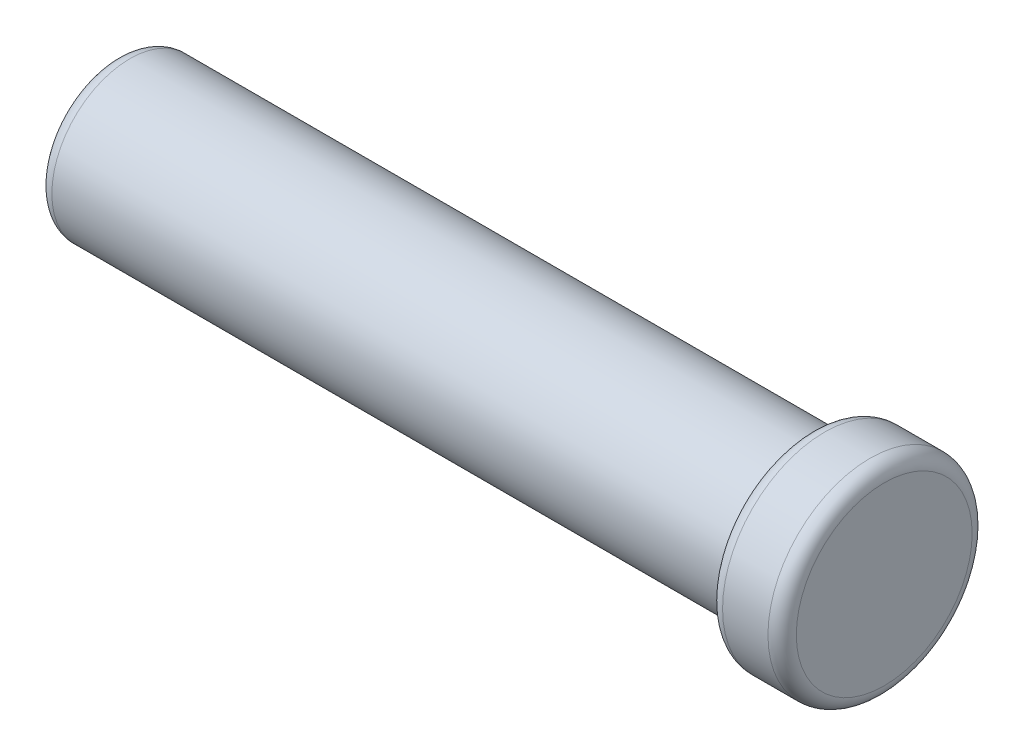
ISO-10303-21;
HEADER;
FILE_DESCRIPTION(('STEP AP214'),'2;1');
FILE_NAME('part.step','',(''),(''),'','','');
FILE_SCHEMA(('AUTOMOTIVE_DESIGN { 1 0 10303 214 1 1 1 1 }'));
ENDSEC;
DATA;
#1=APPLICATION_CONTEXT('core data for automotive mechanical design processes');
#2=APPLICATION_PROTOCOL_DEFINITION('international standard','automotive_design',2000,#1);
#3=PRODUCT_CONTEXT('',#1,'mechanical');
#4=PRODUCT('Part','Part','',(#3));
#5=PRODUCT_RELATED_PRODUCT_CATEGORY('part','',(#4));
#6=PRODUCT_DEFINITION_FORMATION('','',#4);
#7=PRODUCT_DEFINITION_CONTEXT('part definition',#1,'design');
#8=PRODUCT_DEFINITION('design','',#6,#7);
#9=PRODUCT_DEFINITION_SHAPE('','',#8);
#10=(LENGTH_UNIT() NAMED_UNIT(*) SI_UNIT(.MILLI.,.METRE.));
#11=(NAMED_UNIT(*) PLANE_ANGLE_UNIT() SI_UNIT($,.RADIAN.));
#12=(NAMED_UNIT(*) SI_UNIT($,.STERADIAN.) SOLID_ANGLE_UNIT());
#13=UNCERTAINTY_MEASURE_WITH_UNIT(LENGTH_MEASURE(1.E-05),#10,'distance_accuracy_value','');
#14=(GEOMETRIC_REPRESENTATION_CONTEXT(3) GLOBAL_UNCERTAINTY_ASSIGNED_CONTEXT((#13)) GLOBAL_UNIT_ASSIGNED_CONTEXT((#10,
#11,#12)) REPRESENTATION_CONTEXT('',''));
#15=CARTESIAN_POINT('',(0.,0.,0.));
#16=DIRECTION('',(0.,0.,1.));
#17=DIRECTION('',(1.,0.,0.));
#18=AXIS2_PLACEMENT_3D('',#15,#16,#17);
#19=CARTESIAN_POINT('',(0.,0.,-2.75));
#20=DIRECTION('',(1.,0.,0.));
#21=DIRECTION('',(0.,0.,-1.));
#22=AXIS2_PLACEMENT_3D('',#19,#20,#21);
#23=PLANE('',#22);
#24=CARTESIAN_POINT('',(0.,0.,0.));
#25=DIRECTION('',(1.,0.,0.));
#26=DIRECTION('',(0.,0.,-1.));
#27=AXIS2_PLACEMENT_3D('',#24,#25,#26);
#28=CIRCLE('',#27,2.25);
#29=CARTESIAN_POINT('',(0.,0.,-2.25));
#30=VERTEX_POINT('',#29);
#31=EDGE_CURVE('E61',#30,#30,#28,.F.);
#32=ORIENTED_EDGE('',*,*,#31,.T.);
#33=EDGE_LOOP('',(#32));
#34=FACE_BOUND('',#33,.T.);
#35=ADVANCED_FACE('F43',(#34),#23,.F.);
#36=CARTESIAN_POINT('',(27.1,0.,0.));
#37=DIRECTION('',(-1.,0.,0.));
#38=DIRECTION('',(0.,0.,1.));
#39=AXIS2_PLACEMENT_3D('',#36,#37,#38);
#40=PLANE('',#39);
#41=CARTESIAN_POINT('',(27.1,0.,0.));
#42=DIRECTION('',(-1.,0.,0.));
#43=DIRECTION('',(0.,0.,1.));
#44=AXIS2_PLACEMENT_3D('',#41,#42,#43);
#45=CIRCLE('',#44,3.1);
#46=CARTESIAN_POINT('',(27.1,0.,3.1));
#47=VERTEX_POINT('',#46);
#48=EDGE_CURVE('E67',#47,#47,#45,.F.);
#49=ORIENTED_EDGE('',*,*,#48,.T.);
#50=EDGE_LOOP('',(#49));
#51=FACE_BOUND('',#50,.T.);
#52=ADVANCED_FACE('F94',(#51),#40,.F.);
#53=CARTESIAN_POINT('',(0.,0.,0.));
#54=DIRECTION('',(-1.,0.,0.));
#55=DIRECTION('',(0.,0.,1.));
#56=AXIS2_PLACEMENT_3D('',#53,#54,#55);
#57=CYLINDRICAL_SURFACE('',#56,3.6);
#58=CARTESIAN_POINT('',(25.,0.,0.));
#59=DIRECTION('',(1.,0.,0.));
#60=DIRECTION('',(0.,0.,-1.));
#61=AXIS2_PLACEMENT_3D('',#58,#59,#60);
#62=CIRCLE('',#61,3.6);
#63=CARTESIAN_POINT('',(25.,0.,-3.6));
#64=VERTEX_POINT('',#63);
#65=EDGE_CURVE('E10',#64,#64,#62,.T.);
#66=ORIENTED_EDGE('',*,*,#65,.T.);
#67=EDGE_LOOP('',(#66));
#68=FACE_BOUND('',#67,.T.);
#69=CARTESIAN_POINT('',(26.6,0.,0.));
#70=DIRECTION('',(-1.,0.,0.));
#71=DIRECTION('',(0.,0.,1.));
#72=AXIS2_PLACEMENT_3D('',#69,#70,#71);
#73=CIRCLE('',#72,3.6);
#74=CARTESIAN_POINT('',(26.6,0.,3.6));
#75=VERTEX_POINT('',#74);
#76=EDGE_CURVE('E71',#75,#75,#73,.T.);
#77=ORIENTED_EDGE('',*,*,#76,.T.);
#78=EDGE_LOOP('',(#77));
#79=FACE_BOUND('',#78,.T.);
#80=ADVANCED_FACE('F84',(#68,#79),#57,.T.);
#81=CARTESIAN_POINT('',(24.5,0.,-3.6));
#82=DIRECTION('',(1.,0.,0.));
#83=DIRECTION('',(0.,0.,-1.));
#84=AXIS2_PLACEMENT_3D('',#81,#82,#83);
#85=PLANE('',#84);
#86=CARTESIAN_POINT('',(24.5,0.,0.));
#87=DIRECTION('',(1.,0.,0.));
#88=DIRECTION('',(0.,0.,-1.));
#89=AXIS2_PLACEMENT_3D('',#86,#87,#88);
#90=CIRCLE('',#89,3.1);
#91=CARTESIAN_POINT('',(24.5,0.,-3.1));
#92=VERTEX_POINT('',#91);
#93=EDGE_CURVE('E51',#92,#92,#90,.F.);
#94=ORIENTED_EDGE('',*,*,#93,.T.);
#95=EDGE_LOOP('',(#94));
#96=FACE_BOUND('',#95,.T.);
#97=CARTESIAN_POINT('',(24.5,0.,0.));
#98=DIRECTION('',(-1.,0.,0.));
#99=DIRECTION('',(0.,0.,1.));
#100=AXIS2_PLACEMENT_3D('',#97,#98,#99);
#101=CIRCLE('',#100,2.75);
#102=CARTESIAN_POINT('',(24.5,0.,2.75));
#103=VERTEX_POINT('',#102);
#104=EDGE_CURVE('E75',#103,#103,#101,.T.);
#105=ORIENTED_EDGE('',*,*,#104,.F.);
#106=EDGE_LOOP('',(#105));
#107=FACE_BOUND('',#106,.T.);
#108=ADVANCED_FACE('F82',(#96,#107),#85,.F.);
#109=CARTESIAN_POINT('',(0.,0.,0.));
#110=DIRECTION('',(-1.,0.,0.));
#111=DIRECTION('',(0.,0.,1.));
#112=AXIS2_PLACEMENT_3D('',#109,#110,#111);
#113=CYLINDRICAL_SURFACE('',#112,2.75);
#114=CARTESIAN_POINT('',(0.5,0.,0.));
#115=DIRECTION('',(1.,0.,0.));
#116=DIRECTION('',(0.,0.,-1.));
#117=AXIS2_PLACEMENT_3D('',#114,#115,#116);
#118=CIRCLE('',#117,2.75);
#119=CARTESIAN_POINT('',(0.5,0.,-2.75));
#120=VERTEX_POINT('',#119);
#121=EDGE_CURVE('E56',#120,#120,#118,.T.);
#122=ORIENTED_EDGE('',*,*,#121,.T.);
#123=EDGE_LOOP('',(#122));
#124=FACE_BOUND('',#123,.T.);
#125=ORIENTED_EDGE('',*,*,#104,.T.);
#126=EDGE_LOOP('',(#125));
#127=FACE_BOUND('',#126,.T.);
#128=ADVANCED_FACE('F80',(#124,#127),#113,.T.);
#129=CARTESIAN_POINT('',(26.6,0.,0.));
#130=DIRECTION('',(-1.,0.,0.));
#131=DIRECTION('',(0.,0.,1.));
#132=AXIS2_PLACEMENT_3D('',#129,#130,#131);
#133=TOROIDAL_SURFACE('',#132,3.1,0.5);
#134=ORIENTED_EDGE('',*,*,#48,.F.);
#135=EDGE_LOOP('',(#134));
#136=FACE_BOUND('',#135,.T.);
#137=ORIENTED_EDGE('',*,*,#76,.F.);
#138=EDGE_LOOP('',(#137));
#139=FACE_BOUND('',#138,.T.);
#140=ADVANCED_FACE('F91',(#136,#139),#133,.T.);
#141=CARTESIAN_POINT('',(0.5,0.,0.));
#142=DIRECTION('',(1.,0.,0.));
#143=DIRECTION('',(0.,0.,-1.));
#144=AXIS2_PLACEMENT_3D('',#141,#142,#143);
#145=TOROIDAL_SURFACE('',#144,2.25,0.5);
#146=ORIENTED_EDGE('',*,*,#121,.F.);
#147=EDGE_LOOP('',(#146));
#148=FACE_BOUND('',#147,.T.);
#149=ORIENTED_EDGE('',*,*,#31,.F.);
#150=EDGE_LOOP('',(#149));
#151=FACE_BOUND('',#150,.T.);
#152=ADVANCED_FACE('F106',(#148,#151),#145,.T.);
#153=CARTESIAN_POINT('',(25.,0.,0.));
#154=DIRECTION('',(1.,0.,0.));
#155=DIRECTION('',(0.,0.,-1.));
#156=AXIS2_PLACEMENT_3D('',#153,#154,#155);
#157=TOROIDAL_SURFACE('',#156,3.1,0.5);
#158=ORIENTED_EDGE('',*,*,#65,.F.);
#159=EDGE_LOOP('',(#158));
#160=FACE_BOUND('',#159,.T.);
#161=ORIENTED_EDGE('',*,*,#93,.F.);
#162=EDGE_LOOP('',(#161));
#163=FACE_BOUND('',#162,.T.);
#164=ADVANCED_FACE('F45',(#160,#163),#157,.T.);
#165=CLOSED_SHELL('',(#35,#52,#80,#108,#128,#140,#152,#164));
#166=MANIFOLD_SOLID_BREP('B2',#165);
#167=ADVANCED_BREP_SHAPE_REPRESENTATION('',(#18,#166),#14);
#168=SHAPE_DEFINITION_REPRESENTATION(#9,#167);
ENDSEC;
END-ISO-10303-21;
